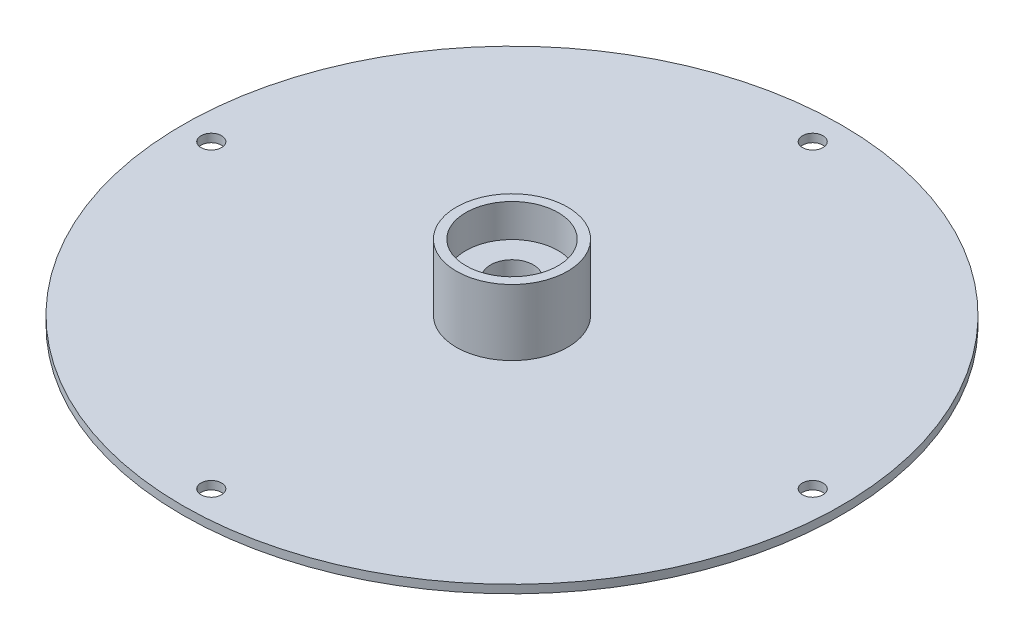
ISO-10303-21;
HEADER;
FILE_DESCRIPTION(('STEP AP214'),'2;1');
FILE_NAME('part.step','',(''),(''),'','','');
FILE_SCHEMA(('AUTOMOTIVE_DESIGN { 1 0 10303 214 1 1 1 1 }'));
ENDSEC;
DATA;
#1=APPLICATION_CONTEXT('core data for automotive mechanical design processes');
#2=APPLICATION_PROTOCOL_DEFINITION('international standard','automotive_design',2000,#1);
#3=PRODUCT_CONTEXT('',#1,'mechanical');
#4=PRODUCT('Part','Part','',(#3));
#5=PRODUCT_RELATED_PRODUCT_CATEGORY('part','',(#4));
#6=PRODUCT_DEFINITION_FORMATION('','',#4);
#7=PRODUCT_DEFINITION_CONTEXT('part definition',#1,'design');
#8=PRODUCT_DEFINITION('design','',#6,#7);
#9=PRODUCT_DEFINITION_SHAPE('','',#8);
#10=(LENGTH_UNIT() NAMED_UNIT(*) SI_UNIT(.MILLI.,.METRE.));
#11=(NAMED_UNIT(*) PLANE_ANGLE_UNIT() SI_UNIT($,.RADIAN.));
#12=(NAMED_UNIT(*) SI_UNIT($,.STERADIAN.) SOLID_ANGLE_UNIT());
#13=UNCERTAINTY_MEASURE_WITH_UNIT(LENGTH_MEASURE(1.E-05),#10,'distance_accuracy_value','');
#14=(GEOMETRIC_REPRESENTATION_CONTEXT(3) GLOBAL_UNCERTAINTY_ASSIGNED_CONTEXT((#13)) GLOBAL_UNIT_ASSIGNED_CONTEXT((#10,
#11,#12)) REPRESENTATION_CONTEXT('',''));
#15=CARTESIAN_POINT('',(0.,0.,0.));
#16=DIRECTION('',(0.,0.,1.));
#17=DIRECTION('',(1.,0.,0.));
#18=AXIS2_PLACEMENT_3D('',#15,#16,#17);
#19=CARTESIAN_POINT('',(0.,10.,0.));
#20=DIRECTION('',(0.,1.,0.));
#21=DIRECTION('',(0.,0.,1.));
#22=AXIS2_PLACEMENT_3D('',#19,#20,#21);
#23=PLANE('',#22);
#24=CARTESIAN_POINT('',(0.,10.,0.));
#25=DIRECTION('',(0.,1.,0.));
#26=DIRECTION('',(0.,0.,1.));
#27=AXIS2_PLACEMENT_3D('',#24,#25,#26);
#28=CIRCLE('',#27,5.2);
#29=CARTESIAN_POINT('',(0.,10.,5.2));
#30=VERTEX_POINT('',#29);
#31=EDGE_CURVE('E101',#30,#30,#28,.T.);
#32=ORIENTED_EDGE('',*,*,#31,.F.);
#33=EDGE_LOOP('',(#32));
#34=FACE_BOUND('',#33,.T.);
#35=CARTESIAN_POINT('',(0.,10.,0.));
#36=DIRECTION('',(0.,1.,0.));
#37=DIRECTION('',(0.,0.,1.));
#38=AXIS2_PLACEMENT_3D('',#35,#36,#37);
#39=CIRCLE('',#38,11.2);
#40=CARTESIAN_POINT('',(0.,10.,11.2));
#41=VERTEX_POINT('',#40);
#42=EDGE_CURVE('E10',#41,#41,#39,.F.);
#43=ORIENTED_EDGE('',*,*,#42,.F.);
#44=EDGE_LOOP('',(#43));
#45=FACE_BOUND('',#44,.T.);
#46=ADVANCED_FACE('F41',(#34,#45),#23,.T.);
#47=CARTESIAN_POINT('',(0.,2.,0.));
#48=DIRECTION('',(0.,1.,0.));
#49=DIRECTION('',(0.,0.,1.));
#50=AXIS2_PLACEMENT_3D('',#47,#48,#49);
#51=PLANE('',#50);
#52=CARTESIAN_POINT('',(0.,2.,0.));
#53=DIRECTION('',(0.,1.,0.));
#54=DIRECTION('',(0.,0.,1.));
#55=AXIS2_PLACEMENT_3D('',#52,#53,#54);
#56=CIRCLE('',#55,80.);
#57=CARTESIAN_POINT('',(0.,2.,80.));
#58=VERTEX_POINT('',#57);
#59=EDGE_CURVE('E49',#58,#58,#56,.T.);
#60=ORIENTED_EDGE('',*,*,#59,.T.);
#61=EDGE_LOOP('',(#60));
#62=FACE_BOUND('',#61,.T.);
#63=CARTESIAN_POINT('',(-73.,2.,0.));
#64=DIRECTION('',(0.,1.,0.));
#65=DIRECTION('',(0.,0.,1.));
#66=AXIS2_PLACEMENT_3D('',#63,#64,#65);
#67=CIRCLE('',#66,2.50000000000001);
#68=CARTESIAN_POINT('',(-73.,2.,2.50000000000002));
#69=VERTEX_POINT('',#68);
#70=EDGE_CURVE('E70',#69,#69,#67,.T.);
#71=ORIENTED_EDGE('',*,*,#70,.F.);
#72=EDGE_LOOP('',(#71));
#73=FACE_BOUND('',#72,.T.);
#74=CARTESIAN_POINT('',(0.,2.,73.));
#75=DIRECTION('',(0.,1.,0.));
#76=DIRECTION('',(0.,0.,1.));
#77=AXIS2_PLACEMENT_3D('',#74,#75,#76);
#78=CIRCLE('',#77,2.5);
#79=CARTESIAN_POINT('',(0.,2.,75.5));
#80=VERTEX_POINT('',#79);
#81=EDGE_CURVE('E79',#80,#80,#78,.T.);
#82=ORIENTED_EDGE('',*,*,#81,.F.);
#83=EDGE_LOOP('',(#82));
#84=FACE_BOUND('',#83,.T.);
#85=CARTESIAN_POINT('',(73.,2.,0.));
#86=DIRECTION('',(0.,1.,0.));
#87=DIRECTION('',(0.,0.,1.));
#88=AXIS2_PLACEMENT_3D('',#85,#86,#87);
#89=CIRCLE('',#88,2.50000000000001);
#90=CARTESIAN_POINT('',(73.,2.,2.5));
#91=VERTEX_POINT('',#90);
#92=EDGE_CURVE('E87',#91,#91,#89,.T.);
#93=ORIENTED_EDGE('',*,*,#92,.F.);
#94=EDGE_LOOP('',(#93));
#95=FACE_BOUND('',#94,.T.);
#96=CARTESIAN_POINT('',(0.,2.,-73.));
#97=DIRECTION('',(0.,1.,0.));
#98=DIRECTION('',(0.,0.,1.));
#99=AXIS2_PLACEMENT_3D('',#96,#97,#98);
#100=CIRCLE('',#99,2.5);
#101=CARTESIAN_POINT('',(0.,2.,-70.5));
#102=VERTEX_POINT('',#101);
#103=EDGE_CURVE('E91',#102,#102,#100,.T.);
#104=ORIENTED_EDGE('',*,*,#103,.F.);
#105=EDGE_LOOP('',(#104));
#106=FACE_BOUND('',#105,.T.);
#107=CARTESIAN_POINT('',(0.,2.,0.));
#108=DIRECTION('',(0.,1.,0.));
#109=DIRECTION('',(0.,0.,1.));
#110=AXIS2_PLACEMENT_3D('',#107,#108,#109);
#111=CIRCLE('',#110,13.5);
#112=CARTESIAN_POINT('',(0.,2.,13.5));
#113=VERTEX_POINT('',#112);
#114=EDGE_CURVE('E71',#113,#113,#111,.T.);
#115=ORIENTED_EDGE('',*,*,#114,.F.);
#116=EDGE_LOOP('',(#115));
#117=FACE_BOUND('',#116,.T.);
#118=ADVANCED_FACE('F131',(#62,#73,#84,#95,#106,#117),#51,.T.);
#119=CARTESIAN_POINT('',(0.,0.,0.));
#120=DIRECTION('',(0.,1.,0.));
#121=DIRECTION('',(0.,0.,1.));
#122=AXIS2_PLACEMENT_3D('',#119,#120,#121);
#123=PLANE('',#122);
#124=CARTESIAN_POINT('',(0.,0.,-73.));
#125=DIRECTION('',(0.,1.,0.));
#126=DIRECTION('',(0.,0.,1.));
#127=AXIS2_PLACEMENT_3D('',#124,#125,#126);
#128=CIRCLE('',#127,2.5);
#129=CARTESIAN_POINT('',(0.,0.,-70.5));
#130=VERTEX_POINT('',#129);
#131=EDGE_CURVE('E65',#130,#130,#128,.T.);
#132=ORIENTED_EDGE('',*,*,#131,.T.);
#133=EDGE_LOOP('',(#132));
#134=FACE_BOUND('',#133,.T.);
#135=CARTESIAN_POINT('',(73.,0.,0.));
#136=DIRECTION('',(0.,1.,0.));
#137=DIRECTION('',(0.,0.,1.));
#138=AXIS2_PLACEMENT_3D('',#135,#136,#137);
#139=CIRCLE('',#138,2.50000000000001);
#140=CARTESIAN_POINT('',(73.,0.,2.5));
#141=VERTEX_POINT('',#140);
#142=EDGE_CURVE('E83',#141,#141,#139,.T.);
#143=ORIENTED_EDGE('',*,*,#142,.T.);
#144=EDGE_LOOP('',(#143));
#145=FACE_BOUND('',#144,.T.);
#146=CARTESIAN_POINT('',(0.,0.,73.));
#147=DIRECTION('',(0.,1.,0.));
#148=DIRECTION('',(0.,0.,1.));
#149=AXIS2_PLACEMENT_3D('',#146,#147,#148);
#150=CIRCLE('',#149,2.5);
#151=CARTESIAN_POINT('',(0.,0.,75.5));
#152=VERTEX_POINT('',#151);
#153=EDGE_CURVE('E75',#152,#152,#150,.T.);
#154=ORIENTED_EDGE('',*,*,#153,.T.);
#155=EDGE_LOOP('',(#154));
#156=FACE_BOUND('',#155,.T.);
#157=CARTESIAN_POINT('',(-73.,0.,0.));
#158=DIRECTION('',(0.,1.,0.));
#159=DIRECTION('',(0.,0.,1.));
#160=AXIS2_PLACEMENT_3D('',#157,#158,#159);
#161=CIRCLE('',#160,2.50000000000001);
#162=CARTESIAN_POINT('',(-73.,0.,2.50000000000002));
#163=VERTEX_POINT('',#162);
#164=EDGE_CURVE('E66',#163,#163,#161,.T.);
#165=ORIENTED_EDGE('',*,*,#164,.T.);
#166=EDGE_LOOP('',(#165));
#167=FACE_BOUND('',#166,.T.);
#168=CARTESIAN_POINT('',(0.,0.,0.));
#169=DIRECTION('',(0.,1.,0.));
#170=DIRECTION('',(0.,0.,1.));
#171=AXIS2_PLACEMENT_3D('',#168,#169,#170);
#172=CIRCLE('',#171,80.);
#173=CARTESIAN_POINT('',(0.,0.,80.));
#174=VERTEX_POINT('',#173);
#175=EDGE_CURVE('E54',#174,#174,#172,.T.);
#176=ORIENTED_EDGE('',*,*,#175,.F.);
#177=EDGE_LOOP('',(#176));
#178=FACE_BOUND('',#177,.T.);
#179=CARTESIAN_POINT('',(0.,0.,0.));
#180=DIRECTION('',(0.,1.,0.));
#181=DIRECTION('',(0.,0.,1.));
#182=AXIS2_PLACEMENT_3D('',#179,#180,#181);
#183=CIRCLE('',#182,5.2);
#184=CARTESIAN_POINT('',(0.,0.,5.2));
#185=VERTEX_POINT('',#184);
#186=EDGE_CURVE('E60',#185,#185,#183,.T.);
#187=ORIENTED_EDGE('',*,*,#186,.T.);
#188=EDGE_LOOP('',(#187));
#189=FACE_BOUND('',#188,.T.);
#190=ADVANCED_FACE('F136',(#134,#145,#156,#167,#178,#189),#123,.F.);
#191=CARTESIAN_POINT('',(0.,2.,0.));
#192=DIRECTION('',(0.,-1.,0.));
#193=DIRECTION('',(0.,0.,-1.));
#194=AXIS2_PLACEMENT_3D('',#191,#192,#193);
#195=CYLINDRICAL_SURFACE('',#194,80.);
#196=ORIENTED_EDGE('',*,*,#59,.F.);
#197=EDGE_LOOP('',(#196));
#198=FACE_BOUND('',#197,.T.);
#199=ORIENTED_EDGE('',*,*,#175,.T.);
#200=EDGE_LOOP('',(#199));
#201=FACE_BOUND('',#200,.T.);
#202=ADVANCED_FACE('F43',(#198,#201),#195,.T.);
#203=CARTESIAN_POINT('',(0.,2.,0.));
#204=DIRECTION('',(0.,-1.,0.));
#205=DIRECTION('',(0.,0.,-1.));
#206=AXIS2_PLACEMENT_3D('',#203,#204,#205);
#207=CYLINDRICAL_SURFACE('',#206,5.2);
#208=ORIENTED_EDGE('',*,*,#186,.F.);
#209=EDGE_LOOP('',(#208));
#210=FACE_BOUND('',#209,.T.);
#211=ORIENTED_EDGE('',*,*,#31,.T.);
#212=EDGE_LOOP('',(#211));
#213=FACE_BOUND('',#212,.T.);
#214=ADVANCED_FACE('F155',(#210,#213),#207,.F.);
#215=CARTESIAN_POINT('',(-73.,0.,0.));
#216=DIRECTION('',(0.,1.,0.));
#217=DIRECTION('',(0.,0.,1.));
#218=AXIS2_PLACEMENT_3D('',#215,#216,#217);
#219=CYLINDRICAL_SURFACE('',#218,2.50000000000001);
#220=ORIENTED_EDGE('',*,*,#164,.F.);
#221=EDGE_LOOP('',(#220));
#222=FACE_BOUND('',#221,.T.);
#223=ORIENTED_EDGE('',*,*,#70,.T.);
#224=EDGE_LOOP('',(#223));
#225=FACE_BOUND('',#224,.T.);
#226=ADVANCED_FACE('F151',(#222,#225),#219,.F.);
#227=CARTESIAN_POINT('',(0.,0.,73.));
#228=DIRECTION('',(0.,1.,0.));
#229=DIRECTION('',(0.,0.,1.));
#230=AXIS2_PLACEMENT_3D('',#227,#228,#229);
#231=CYLINDRICAL_SURFACE('',#230,2.5);
#232=ORIENTED_EDGE('',*,*,#153,.F.);
#233=EDGE_LOOP('',(#232));
#234=FACE_BOUND('',#233,.T.);
#235=ORIENTED_EDGE('',*,*,#81,.T.);
#236=EDGE_LOOP('',(#235));
#237=FACE_BOUND('',#236,.T.);
#238=ADVANCED_FACE('F147',(#234,#237),#231,.F.);
#239=CARTESIAN_POINT('',(73.,0.,0.));
#240=DIRECTION('',(0.,1.,0.));
#241=DIRECTION('',(0.,0.,1.));
#242=AXIS2_PLACEMENT_3D('',#239,#240,#241);
#243=CYLINDRICAL_SURFACE('',#242,2.50000000000001);
#244=ORIENTED_EDGE('',*,*,#142,.F.);
#245=EDGE_LOOP('',(#244));
#246=FACE_BOUND('',#245,.T.);
#247=ORIENTED_EDGE('',*,*,#92,.T.);
#248=EDGE_LOOP('',(#247));
#249=FACE_BOUND('',#248,.T.);
#250=ADVANCED_FACE('F143',(#246,#249),#243,.F.);
#251=CARTESIAN_POINT('',(0.,0.,-73.));
#252=DIRECTION('',(0.,1.,0.));
#253=DIRECTION('',(0.,0.,1.));
#254=AXIS2_PLACEMENT_3D('',#251,#252,#253);
#255=CYLINDRICAL_SURFACE('',#254,2.5);
#256=ORIENTED_EDGE('',*,*,#131,.F.);
#257=EDGE_LOOP('',(#256));
#258=FACE_BOUND('',#257,.T.);
#259=ORIENTED_EDGE('',*,*,#103,.T.);
#260=EDGE_LOOP('',(#259));
#261=FACE_BOUND('',#260,.T.);
#262=ADVANCED_FACE('F126',(#258,#261),#255,.F.);
#263=CARTESIAN_POINT('',(0.,10.,0.));
#264=DIRECTION('',(0.,-1.,0.));
#265=DIRECTION('',(0.,0.,-1.));
#266=AXIS2_PLACEMENT_3D('',#263,#264,#265);
#267=CYLINDRICAL_SURFACE('',#266,13.5);
#268=ORIENTED_EDGE('',*,*,#114,.T.);
#269=EDGE_LOOP('',(#268));
#270=FACE_BOUND('',#269,.T.);
#271=CARTESIAN_POINT('',(0.,18.,0.));
#272=DIRECTION('',(0.,1.,0.));
#273=DIRECTION('',(0.,0.,1.));
#274=AXIS2_PLACEMENT_3D('',#271,#272,#273);
#275=CIRCLE('',#274,13.5);
#276=CARTESIAN_POINT('',(0.,18.,13.5));
#277=VERTEX_POINT('',#276);
#278=EDGE_CURVE('E105',#277,#277,#275,.T.);
#279=ORIENTED_EDGE('',*,*,#278,.F.);
#280=EDGE_LOOP('',(#279));
#281=FACE_BOUND('',#280,.T.);
#282=ADVANCED_FACE('F118',(#270,#281),#267,.T.);
#283=CARTESIAN_POINT('',(0.,18.,0.));
#284=DIRECTION('',(0.,1.,0.));
#285=DIRECTION('',(0.,0.,1.));
#286=AXIS2_PLACEMENT_3D('',#283,#284,#285);
#287=PLANE('',#286);
#288=ORIENTED_EDGE('',*,*,#278,.T.);
#289=EDGE_LOOP('',(#288));
#290=FACE_BOUND('',#289,.T.);
#291=CARTESIAN_POINT('',(0.,18.,0.));
#292=DIRECTION('',(0.,1.,0.));
#293=DIRECTION('',(0.,0.,1.));
#294=AXIS2_PLACEMENT_3D('',#291,#292,#293);
#295=CIRCLE('',#294,11.2);
#296=CARTESIAN_POINT('',(0.,18.,11.2));
#297=VERTEX_POINT('',#296);
#298=EDGE_CURVE('E109',#297,#297,#295,.T.);
#299=ORIENTED_EDGE('',*,*,#298,.F.);
#300=EDGE_LOOP('',(#299));
#301=FACE_BOUND('',#300,.T.);
#302=ADVANCED_FACE('F116',(#290,#301),#287,.T.);
#303=CARTESIAN_POINT('',(0.,18.,0.));
#304=DIRECTION('',(0.,-1.,0.));
#305=DIRECTION('',(0.,0.,-1.));
#306=AXIS2_PLACEMENT_3D('',#303,#304,#305);
#307=CYLINDRICAL_SURFACE('',#306,11.2);
#308=ORIENTED_EDGE('',*,*,#298,.T.);
#309=EDGE_LOOP('',(#308));
#310=FACE_BOUND('',#309,.T.);
#311=ORIENTED_EDGE('',*,*,#42,.T.);
#312=EDGE_LOOP('',(#311));
#313=FACE_BOUND('',#312,.T.);
#314=ADVANCED_FACE('F114',(#310,#313),#307,.F.);
#315=CLOSED_SHELL('',(#46,#118,#190,#202,#214,#226,#238,#250,#262,#282,#302,#314));
#316=MANIFOLD_SOLID_BREP('B2',#315);
#317=ADVANCED_BREP_SHAPE_REPRESENTATION('',(#18,#316),#14);
#318=SHAPE_DEFINITION_REPRESENTATION(#9,#317);
ENDSEC;
END-ISO-10303-21;
